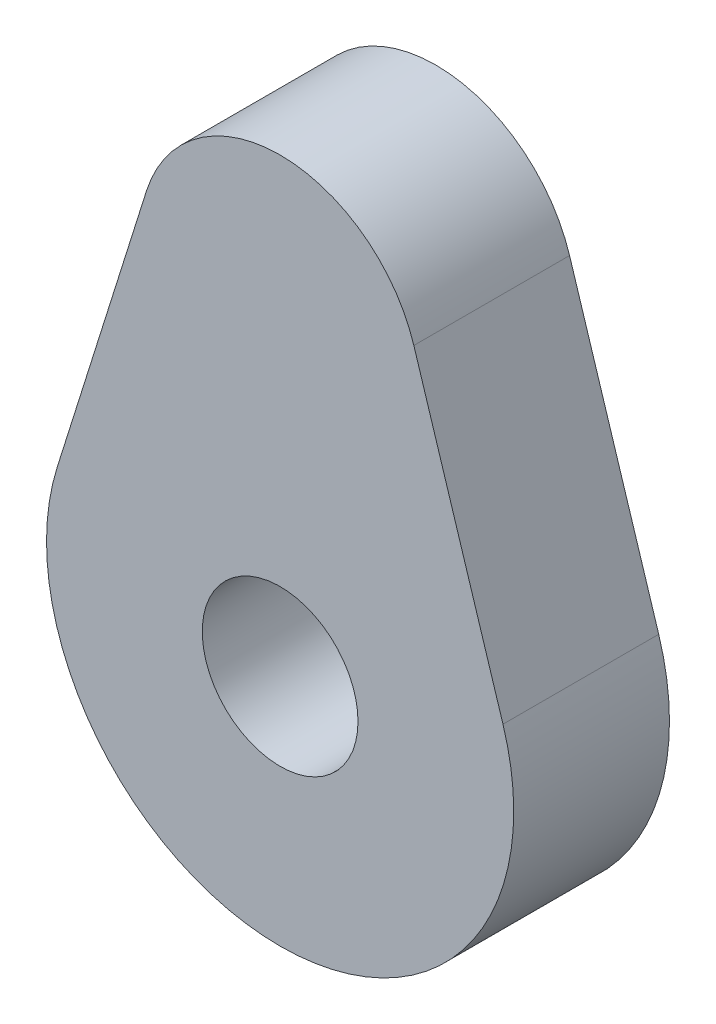
ISO-10303-21;
HEADER;
FILE_DESCRIPTION(('STEP AP214'),'2;1');
FILE_NAME('part.step','',(''),(''),'','','');
FILE_SCHEMA(('AUTOMOTIVE_DESIGN { 1 0 10303 214 1 1 1 1 }'));
ENDSEC;
DATA;
#1=APPLICATION_CONTEXT('core data for automotive mechanical design processes');
#2=APPLICATION_PROTOCOL_DEFINITION('international standard','automotive_design',2000,#1);
#3=PRODUCT_CONTEXT('',#1,'mechanical');
#4=PRODUCT('Part','Part','',(#3));
#5=PRODUCT_RELATED_PRODUCT_CATEGORY('part','',(#4));
#6=PRODUCT_DEFINITION_FORMATION('','',#4);
#7=PRODUCT_DEFINITION_CONTEXT('part definition',#1,'design');
#8=PRODUCT_DEFINITION('design','',#6,#7);
#9=PRODUCT_DEFINITION_SHAPE('','',#8);
#10=(LENGTH_UNIT() NAMED_UNIT(*) SI_UNIT(.MILLI.,.METRE.));
#11=(NAMED_UNIT(*) PLANE_ANGLE_UNIT() SI_UNIT($,.RADIAN.));
#12=(NAMED_UNIT(*) SI_UNIT($,.STERADIAN.) SOLID_ANGLE_UNIT());
#13=UNCERTAINTY_MEASURE_WITH_UNIT(LENGTH_MEASURE(1.E-05),#10,'distance_accuracy_value','');
#14=(GEOMETRIC_REPRESENTATION_CONTEXT(3) GLOBAL_UNCERTAINTY_ASSIGNED_CONTEXT((#13)) GLOBAL_UNIT_ASSIGNED_CONTEXT((#10,
#11,#12)) REPRESENTATION_CONTEXT('',''));
#15=CARTESIAN_POINT('',(0.,0.,0.));
#16=DIRECTION('',(0.,0.,1.));
#17=DIRECTION('',(1.,0.,0.));
#18=AXIS2_PLACEMENT_3D('',#15,#16,#17);
#19=CARTESIAN_POINT('',(0.,50.8,25.4));
#20=DIRECTION('',(0.,0.,1.));
#21=DIRECTION('',(1.,0.,0.));
#22=AXIS2_PLACEMENT_3D('',#19,#20,#21);
#23=PLANE('',#22);
#24=CARTESIAN_POINT('',(0.,50.8,25.4));
#25=DIRECTION('',(0.,0.,1.));
#26=DIRECTION('',(1.,0.,0.));
#27=AXIS2_PLACEMENT_3D('',#24,#25,#26);
#28=CIRCLE('',#27,22.86);
#29=CARTESIAN_POINT('',(21.8070501443914,57.658,25.4));
#30=VERTEX_POINT('',#29);
#31=CARTESIAN_POINT('',(-21.8070501443914,57.658,25.4));
#32=VERTEX_POINT('',#31);
#33=EDGE_CURVE('E85',#30,#32,#28,.T.);
#34=ORIENTED_EDGE('',*,*,#33,.T.);
#35=DIRECTION('',(-0.3,-0.953939201416946,0.));
#36=VECTOR('',#35,1.);
#37=CARTESIAN_POINT('',(-21.8070501443914,57.658,25.4));
#38=LINE('',#37,#36);
#39=CARTESIAN_POINT('',(-36.3450835739856,11.43,25.4));
#40=VERTEX_POINT('',#39);
#41=EDGE_CURVE('E80',#32,#40,#38,.T.);
#42=ORIENTED_EDGE('',*,*,#41,.T.);
#43=CARTESIAN_POINT('',(0.,0.,25.4));
#44=DIRECTION('',(0.,0.,1.));
#45=DIRECTION('',(1.,0.,0.));
#46=AXIS2_PLACEMENT_3D('',#43,#44,#45);
#47=CIRCLE('',#46,38.1);
#48=CARTESIAN_POINT('',(36.3450835739856,11.43,25.4));
#49=VERTEX_POINT('',#48);
#50=EDGE_CURVE('E83',#40,#49,#47,.T.);
#51=ORIENTED_EDGE('',*,*,#50,.T.);
#52=DIRECTION('',(-0.3,0.953939201416946,0.));
#53=VECTOR('',#52,1.);
#54=CARTESIAN_POINT('',(21.8070501443914,57.658,25.4));
#55=LINE('',#54,#53);
#56=EDGE_CURVE('E50',#49,#30,#55,.T.);
#57=ORIENTED_EDGE('',*,*,#56,.T.);
#58=EDGE_LOOP('',(#34,#42,#51,#57));
#59=FACE_BOUND('',#58,.T.);
#60=CARTESIAN_POINT('',(0.,0.,25.4));
#61=DIRECTION('',(0.,0.,1.));
#62=DIRECTION('',(1.,0.,0.));
#63=AXIS2_PLACEMENT_3D('',#60,#61,#62);
#64=CIRCLE('',#63,12.7);
#65=CARTESIAN_POINT('',(12.7,0.,25.4));
#66=VERTEX_POINT('',#65);
#67=EDGE_CURVE('E100',#66,#66,#64,.T.);
#68=ORIENTED_EDGE('',*,*,#67,.F.);
#69=EDGE_LOOP('',(#68));
#70=FACE_BOUND('',#69,.T.);
#71=ADVANCED_FACE('F33',(#59,#70),#23,.T.);
#72=CARTESIAN_POINT('',(0.,50.8,0.));
#73=DIRECTION('',(0.,0.,1.));
#74=DIRECTION('',(1.,0.,0.));
#75=AXIS2_PLACEMENT_3D('',#72,#73,#74);
#76=PLANE('',#75);
#77=CARTESIAN_POINT('',(0.,50.8,0.));
#78=DIRECTION('',(0.,0.,1.));
#79=DIRECTION('',(1.,0.,0.));
#80=AXIS2_PLACEMENT_3D('',#77,#78,#79);
#81=CIRCLE('',#80,22.86);
#82=CARTESIAN_POINT('',(21.8070501443914,57.658,0.));
#83=VERTEX_POINT('',#82);
#84=CARTESIAN_POINT('',(-21.8070501443914,57.658,0.));
#85=VERTEX_POINT('',#84);
#86=EDGE_CURVE('E97',#83,#85,#81,.T.);
#87=ORIENTED_EDGE('',*,*,#86,.F.);
#88=DIRECTION('',(-0.3,0.953939201416946,0.));
#89=VECTOR('',#88,1.);
#90=CARTESIAN_POINT('',(21.8070501443914,57.658,0.));
#91=LINE('',#90,#89);
#92=CARTESIAN_POINT('',(36.3450835739856,11.43,0.));
#93=VERTEX_POINT('',#92);
#94=EDGE_CURVE('E73',#93,#83,#91,.T.);
#95=ORIENTED_EDGE('',*,*,#94,.F.);
#96=CARTESIAN_POINT('',(0.,0.,0.));
#97=DIRECTION('',(0.,0.,1.));
#98=DIRECTION('',(1.,0.,0.));
#99=AXIS2_PLACEMENT_3D('',#96,#97,#98);
#100=CIRCLE('',#99,38.1);
#101=CARTESIAN_POINT('',(-36.3450835739856,11.43,0.));
#102=VERTEX_POINT('',#101);
#103=EDGE_CURVE('E67',#102,#93,#100,.T.);
#104=ORIENTED_EDGE('',*,*,#103,.F.);
#105=DIRECTION('',(-0.3,-0.953939201416946,0.));
#106=VECTOR('',#105,1.);
#107=CARTESIAN_POINT('',(-21.8070501443914,57.658,0.));
#108=LINE('',#107,#106);
#109=EDGE_CURVE('E89',#85,#102,#108,.T.);
#110=ORIENTED_EDGE('',*,*,#109,.F.);
#111=EDGE_LOOP('',(#87,#95,#104,#110));
#112=FACE_BOUND('',#111,.T.);
#113=CARTESIAN_POINT('',(0.,0.,0.));
#114=DIRECTION('',(0.,0.,1.));
#115=DIRECTION('',(1.,0.,0.));
#116=AXIS2_PLACEMENT_3D('',#113,#114,#115);
#117=CIRCLE('',#116,12.7);
#118=CARTESIAN_POINT('',(12.7,0.,0.));
#119=VERTEX_POINT('',#118);
#120=EDGE_CURVE('E112',#119,#119,#117,.T.);
#121=ORIENTED_EDGE('',*,*,#120,.T.);
#122=EDGE_LOOP('',(#121));
#123=FACE_BOUND('',#122,.T.);
#124=ADVANCED_FACE('F108',(#112,#123),#76,.F.);
#125=CARTESIAN_POINT('',(0.,50.8,25.4));
#126=DIRECTION('',(0.,0.,-1.));
#127=DIRECTION('',(-1.,0.,0.));
#128=AXIS2_PLACEMENT_3D('',#125,#126,#127);
#129=CYLINDRICAL_SURFACE('',#128,22.86);
#130=ORIENTED_EDGE('',*,*,#86,.T.);
#131=DIRECTION('',(0.,0.,-1.));
#132=VECTOR('',#131,1.);
#133=CARTESIAN_POINT('',(-21.8070501443914,57.658,25.4));
#134=LINE('',#133,#132);
#135=EDGE_CURVE('E11',#32,#85,#134,.T.);
#136=ORIENTED_EDGE('',*,*,#135,.F.);
#137=ORIENTED_EDGE('',*,*,#33,.F.);
#138=DIRECTION('',(0.,0.,-1.));
#139=VECTOR('',#138,1.);
#140=CARTESIAN_POINT('',(21.8070501443914,57.658,25.4));
#141=LINE('',#140,#139);
#142=EDGE_CURVE('E93',#30,#83,#141,.T.);
#143=ORIENTED_EDGE('',*,*,#142,.T.);
#144=EDGE_LOOP('',(#130,#136,#137,#143));
#145=FACE_BOUND('',#144,.T.);
#146=ADVANCED_FACE('F35',(#145),#129,.T.);
#147=CARTESIAN_POINT('',(-21.8070501443914,57.658,25.4));
#148=DIRECTION('',(0.953939201416946,-0.3,0.));
#149=DIRECTION('',(0.3,0.953939201416946,0.));
#150=AXIS2_PLACEMENT_3D('',#147,#148,#149);
#151=PLANE('',#150);
#152=ORIENTED_EDGE('',*,*,#109,.T.);
#153=DIRECTION('',(0.,0.,-1.));
#154=VECTOR('',#153,1.);
#155=CARTESIAN_POINT('',(-36.3450835739856,11.43,25.4));
#156=LINE('',#155,#154);
#157=EDGE_CURVE('E42',#40,#102,#156,.T.);
#158=ORIENTED_EDGE('',*,*,#157,.F.);
#159=ORIENTED_EDGE('',*,*,#41,.F.);
#160=ORIENTED_EDGE('',*,*,#135,.T.);
#161=EDGE_LOOP('',(#152,#158,#159,#160));
#162=FACE_BOUND('',#161,.T.);
#163=ADVANCED_FACE('F88',(#162),#151,.F.);
#164=CARTESIAN_POINT('',(0.,0.,25.4));
#165=DIRECTION('',(0.,0.,-1.));
#166=DIRECTION('',(-1.,0.,0.));
#167=AXIS2_PLACEMENT_3D('',#164,#165,#166);
#168=CYLINDRICAL_SURFACE('',#167,38.1);
#169=ORIENTED_EDGE('',*,*,#103,.T.);
#170=DIRECTION('',(0.,0.,-1.));
#171=VECTOR('',#170,1.);
#172=CARTESIAN_POINT('',(36.3450835739856,11.43,25.4));
#173=LINE('',#172,#171);
#174=EDGE_CURVE('E90',#49,#93,#173,.T.);
#175=ORIENTED_EDGE('',*,*,#174,.F.);
#176=ORIENTED_EDGE('',*,*,#50,.F.);
#177=ORIENTED_EDGE('',*,*,#157,.T.);
#178=EDGE_LOOP('',(#169,#175,#176,#177));
#179=FACE_BOUND('',#178,.T.);
#180=ADVANCED_FACE('F91',(#179),#168,.T.);
#181=CARTESIAN_POINT('',(21.8070501443914,57.658,25.4));
#182=DIRECTION('',(-0.953939201416946,-0.3,0.));
#183=DIRECTION('',(0.3,-0.953939201416946,0.));
#184=AXIS2_PLACEMENT_3D('',#181,#182,#183);
#185=PLANE('',#184);
#186=ORIENTED_EDGE('',*,*,#94,.T.);
#187=ORIENTED_EDGE('',*,*,#142,.F.);
#188=ORIENTED_EDGE('',*,*,#56,.F.);
#189=ORIENTED_EDGE('',*,*,#174,.T.);
#190=EDGE_LOOP('',(#186,#187,#188,#189));
#191=FACE_BOUND('',#190,.T.);
#192=ADVANCED_FACE('F105',(#191),#185,.F.);
#193=CARTESIAN_POINT('',(0.,0.,25.4));
#194=DIRECTION('',(0.,0.,-1.));
#195=DIRECTION('',(-1.,0.,0.));
#196=AXIS2_PLACEMENT_3D('',#193,#194,#195);
#197=CYLINDRICAL_SURFACE('',#196,12.7);
#198=ORIENTED_EDGE('',*,*,#67,.T.);
#199=EDGE_LOOP('',(#198));
#200=FACE_BOUND('',#199,.T.);
#201=ORIENTED_EDGE('',*,*,#120,.F.);
#202=EDGE_LOOP('',(#201));
#203=FACE_BOUND('',#202,.T.);
#204=ADVANCED_FACE('F118',(#200,#203),#197,.F.);
#205=CLOSED_SHELL('',(#71,#124,#146,#163,#180,#192,#204));
#206=MANIFOLD_SOLID_BREP('B2',#205);
#207=ADVANCED_BREP_SHAPE_REPRESENTATION('',(#18,#206),#14);
#208=SHAPE_DEFINITION_REPRESENTATION(#9,#207);
ENDSEC;
END-ISO-10303-21;
